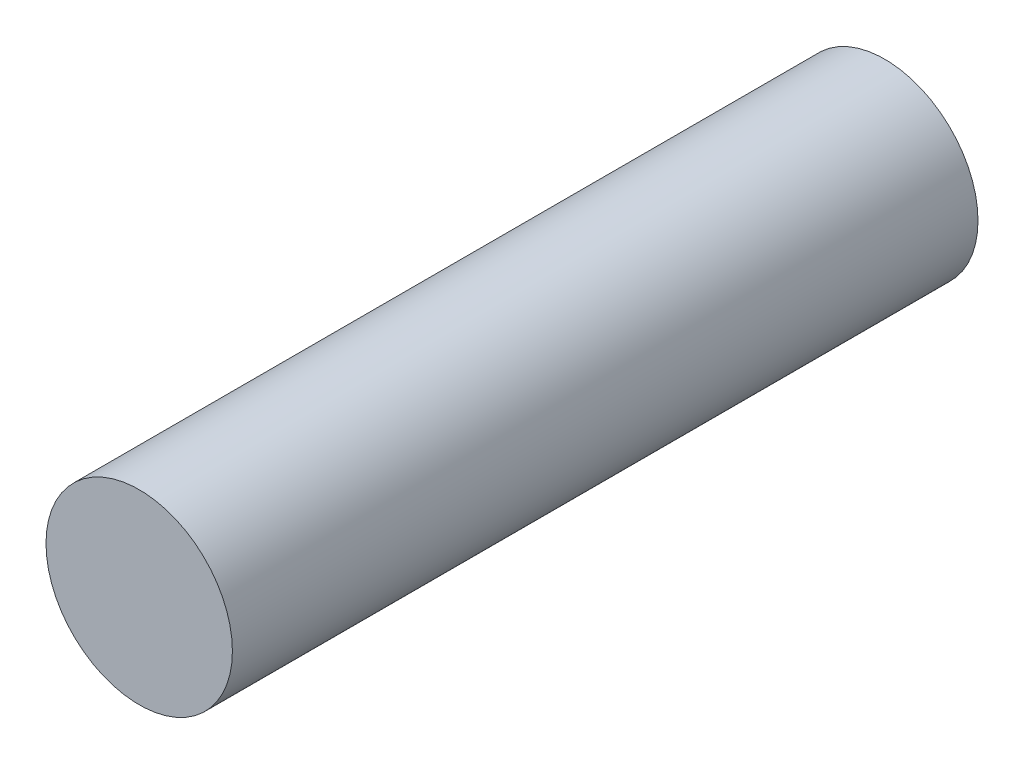
ISO-10303-21;
HEADER;
FILE_DESCRIPTION(('STEP AP214'),'2;1');
FILE_NAME('part.step','',(''),(''),'','','');
FILE_SCHEMA(('AUTOMOTIVE_DESIGN { 1 0 10303 214 1 1 1 1 }'));
ENDSEC;
DATA;
#1=APPLICATION_CONTEXT('core data for automotive mechanical design processes');
#2=APPLICATION_PROTOCOL_DEFINITION('international standard','automotive_design',2000,#1);
#3=PRODUCT_CONTEXT('',#1,'mechanical');
#4=PRODUCT('Part','Part','',(#3));
#5=PRODUCT_RELATED_PRODUCT_CATEGORY('part','',(#4));
#6=PRODUCT_DEFINITION_FORMATION('','',#4);
#7=PRODUCT_DEFINITION_CONTEXT('part definition',#1,'design');
#8=PRODUCT_DEFINITION('design','',#6,#7);
#9=PRODUCT_DEFINITION_SHAPE('','',#8);
#10=(LENGTH_UNIT() NAMED_UNIT(*) SI_UNIT(.MILLI.,.METRE.));
#11=(NAMED_UNIT(*) PLANE_ANGLE_UNIT() SI_UNIT($,.RADIAN.));
#12=(NAMED_UNIT(*) SI_UNIT($,.STERADIAN.) SOLID_ANGLE_UNIT());
#13=UNCERTAINTY_MEASURE_WITH_UNIT(LENGTH_MEASURE(1.E-05),#10,'distance_accuracy_value','');
#14=(GEOMETRIC_REPRESENTATION_CONTEXT(3) GLOBAL_UNCERTAINTY_ASSIGNED_CONTEXT((#13)) GLOBAL_UNIT_ASSIGNED_CONTEXT((#10,
#11,#12)) REPRESENTATION_CONTEXT('',''));
#15=CARTESIAN_POINT('',(0.,0.,0.));
#16=DIRECTION('',(0.,0.,1.));
#17=DIRECTION('',(1.,0.,0.));
#18=AXIS2_PLACEMENT_3D('',#15,#16,#17);
#19=CARTESIAN_POINT('',(0.,0.,200.));
#20=DIRECTION('',(0.,0.,-1.));
#21=DIRECTION('',(-1.,0.,0.));
#22=AXIS2_PLACEMENT_3D('',#19,#20,#21);
#23=CYLINDRICAL_SURFACE('',#22,50.);
#24=CARTESIAN_POINT('',(0.,0.,200.));
#25=DIRECTION('',(0.,0.,1.));
#26=DIRECTION('',(1.,0.,0.));
#27=AXIS2_PLACEMENT_3D('',#24,#25,#26);
#28=CIRCLE('',#27,50.);
#29=CARTESIAN_POINT('',(50.,0.,200.));
#30=VERTEX_POINT('',#29);
#31=EDGE_CURVE('E10',#30,#30,#28,.T.);
#32=ORIENTED_EDGE('',*,*,#31,.F.);
#33=EDGE_LOOP('',(#32));
#34=FACE_BOUND('',#33,.T.);
#35=CARTESIAN_POINT('',(0.,0.,-200.));
#36=DIRECTION('',(0.,0.,1.));
#37=DIRECTION('',(1.,0.,0.));
#38=AXIS2_PLACEMENT_3D('',#35,#36,#37);
#39=CIRCLE('',#38,50.);
#40=CARTESIAN_POINT('',(50.,0.,-200.));
#41=VERTEX_POINT('',#40);
#42=EDGE_CURVE('E40',#41,#41,#39,.T.);
#43=ORIENTED_EDGE('',*,*,#42,.T.);
#44=EDGE_LOOP('',(#43));
#45=FACE_BOUND('',#44,.T.);
#46=ADVANCED_FACE('F37',(#34,#45),#23,.T.);
#47=CARTESIAN_POINT('',(0.,0.,200.));
#48=DIRECTION('',(0.,0.,1.));
#49=DIRECTION('',(1.,0.,0.));
#50=AXIS2_PLACEMENT_3D('',#47,#48,#49);
#51=PLANE('',#50);
#52=ORIENTED_EDGE('',*,*,#31,.T.);
#53=EDGE_LOOP('',(#52));
#54=FACE_BOUND('',#53,.T.);
#55=ADVANCED_FACE('F54',(#54),#51,.T.);
#56=CARTESIAN_POINT('',(0.,0.,-200.));
#57=DIRECTION('',(0.,0.,1.));
#58=DIRECTION('',(1.,0.,0.));
#59=AXIS2_PLACEMENT_3D('',#56,#57,#58);
#60=PLANE('',#59);
#61=ORIENTED_EDGE('',*,*,#42,.F.);
#62=EDGE_LOOP('',(#61));
#63=FACE_BOUND('',#62,.T.);
#64=ADVANCED_FACE('F52',(#63),#60,.F.);
#65=CLOSED_SHELL('',(#46,#55,#64));
#66=MANIFOLD_SOLID_BREP('B2',#65);
#67=ADVANCED_BREP_SHAPE_REPRESENTATION('',(#18,#66),#14);
#68=SHAPE_DEFINITION_REPRESENTATION(#9,#67);
ENDSEC;
END-ISO-10303-21;
